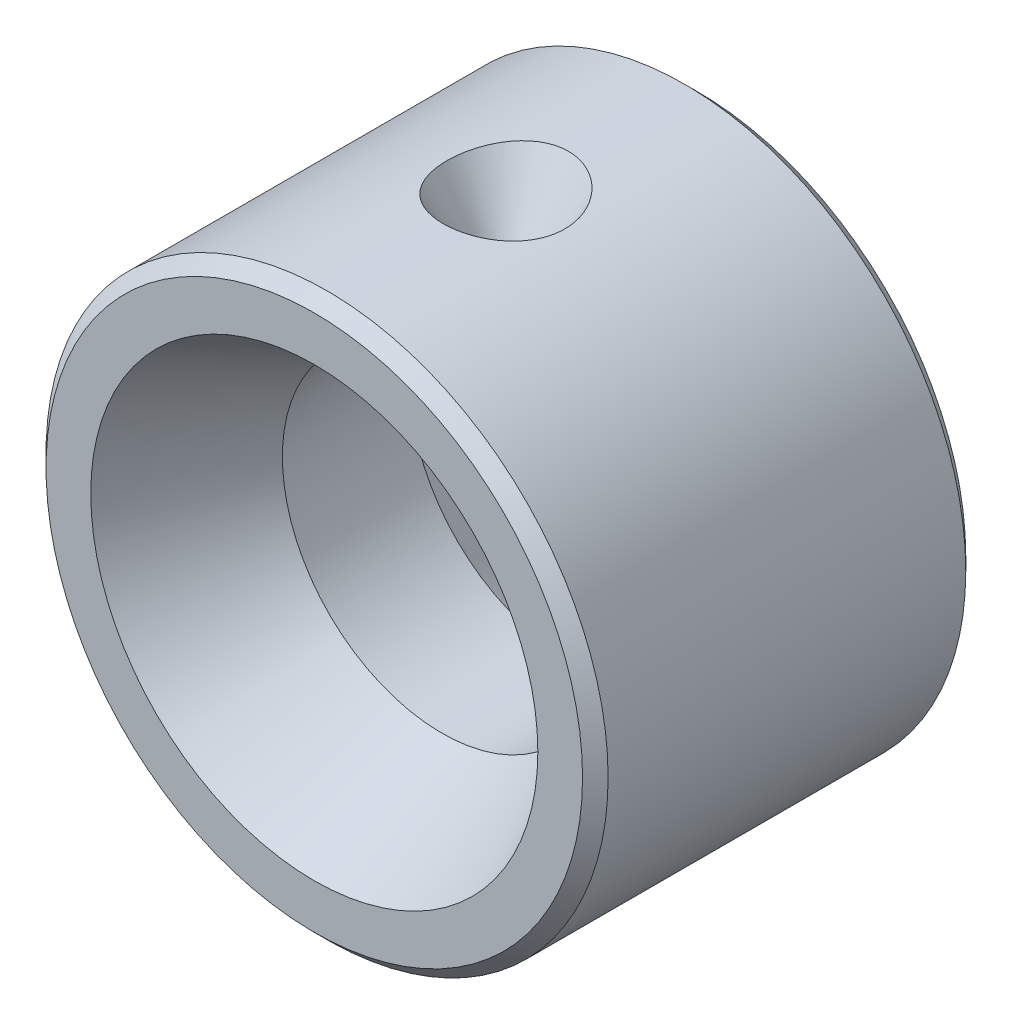
ISO-10303-21;
HEADER;
FILE_DESCRIPTION(('STEP AP214'),'2;1');
FILE_NAME('part.step','',(''),(''),'','','');
FILE_SCHEMA(('AUTOMOTIVE_DESIGN { 1 0 10303 214 1 1 1 1 }'));
ENDSEC;
DATA;
#1=APPLICATION_CONTEXT('core data for automotive mechanical design processes');
#2=APPLICATION_PROTOCOL_DEFINITION('international standard','automotive_design',2000,#1);
#3=PRODUCT_CONTEXT('',#1,'mechanical');
#4=PRODUCT('Part','Part','',(#3));
#5=PRODUCT_RELATED_PRODUCT_CATEGORY('part','',(#4));
#6=PRODUCT_DEFINITION_FORMATION('','',#4);
#7=PRODUCT_DEFINITION_CONTEXT('part definition',#1,'design');
#8=PRODUCT_DEFINITION('design','',#6,#7);
#9=PRODUCT_DEFINITION_SHAPE('','',#8);
#10=(LENGTH_UNIT() NAMED_UNIT(*) SI_UNIT(.MILLI.,.METRE.));
#11=(NAMED_UNIT(*) PLANE_ANGLE_UNIT() SI_UNIT($,.RADIAN.));
#12=(NAMED_UNIT(*) SI_UNIT($,.STERADIAN.) SOLID_ANGLE_UNIT());
#13=UNCERTAINTY_MEASURE_WITH_UNIT(LENGTH_MEASURE(1.E-05),#10,'distance_accuracy_value','');
#14=(GEOMETRIC_REPRESENTATION_CONTEXT(3) GLOBAL_UNCERTAINTY_ASSIGNED_CONTEXT((#13)) GLOBAL_UNIT_ASSIGNED_CONTEXT((#10,
#11,#12)) REPRESENTATION_CONTEXT('',''));
#15=CARTESIAN_POINT('',(0.,0.,0.));
#16=DIRECTION('',(0.,0.,1.));
#17=DIRECTION('',(1.,0.,0.));
#18=AXIS2_PLACEMENT_3D('',#15,#16,#17);
#19=CARTESIAN_POINT('',(0.,0.,15.));
#20=DIRECTION('',(0.,0.,-1.));
#21=DIRECTION('',(-1.,0.,0.));
#22=AXIS2_PLACEMENT_3D('',#19,#20,#21);
#23=CYLINDRICAL_SURFACE('',#22,22.);
#24=CARTESIAN_POINT('',(0.,0.,-14.));
#25=DIRECTION('',(0.,0.,1.));
#26=DIRECTION('',(1.,0.,0.));
#27=AXIS2_PLACEMENT_3D('',#24,#25,#26);
#28=CIRCLE('',#27,22.);
#29=CARTESIAN_POINT('',(22.,0.,-14.));
#30=VERTEX_POINT('',#29);
#31=EDGE_CURVE('E75',#30,#30,#28,.T.);
#32=ORIENTED_EDGE('',*,*,#31,.T.);
#33=EDGE_LOOP('',(#32));
#34=FACE_BOUND('',#33,.T.);
#35=CARTESIAN_POINT('',(0.,0.,14.));
#36=DIRECTION('',(0.,0.,1.));
#37=DIRECTION('',(1.,0.,0.));
#38=AXIS2_PLACEMENT_3D('',#35,#36,#37);
#39=CIRCLE('',#38,22.);
#40=CARTESIAN_POINT('',(22.,0.,14.));
#41=VERTEX_POINT('',#40);
#42=EDGE_CURVE('E71',#41,#41,#39,.F.);
#43=ORIENTED_EDGE('',*,*,#42,.T.);
#44=EDGE_LOOP('',(#43));
#45=FACE_BOUND('',#44,.T.);
#46=CARTESIAN_POINT('',(-3.99482145973664,-21.6342645813717,-2.46917415116023));
#47=CARTESIAN_POINT('',(-3.86755959370155,-21.6577634169543,-2.70086556031943));
#48=CARTESIAN_POINT('',(-3.72193169680851,-21.6835058371343,-2.92232084510366));
#49=CARTESIAN_POINT('',(-3.39673047581251,-21.7368194592095,-3.33869689986199));
#50=CARTESIAN_POINT('',(-3.21713833851181,-21.7643916691266,-3.5336028604263));
#51=CARTESIAN_POINT('',(-2.81987022044868,-21.8194881921199,-3.89806332118038));
#52=CARTESIAN_POINT('',(-2.60094855707441,-21.8469655468134,-4.06627512376035));
#53=CARTESIAN_POINT('',(-2.13608139818247,-21.8972974755466,-4.36090285168833));
#54=CARTESIAN_POINT('',(-1.89014578843575,-21.9201537320394,-4.48733399924678));
#55=CARTESIAN_POINT('',(-1.39433623794611,-21.9570889774808,-4.68651839375952));
#56=CARTESIAN_POINT('',(-1.14562859005345,-21.9716202529632,-4.76208781689322));
#57=CARTESIAN_POINT('',(-0.638465201664187,-21.9921945211101,-4.86810844120732));
#58=CARTESIAN_POINT('',(-0.380014065653917,-21.998241472839,-4.89858068657776));
#59=CARTESIAN_POINT('',(0.122438535735009,-22.0010072838138,-4.91257196544603));
#60=CARTESIAN_POINT('',(0.366364959656477,-21.9982700152922,-4.89882846689838));
#61=CARTESIAN_POINT('',(0.848275479673287,-21.9849614327014,-4.83092137968877));
#62=CARTESIAN_POINT('',(1.0862599815312,-21.9743906550885,-4.77676055889383));
#63=CARTESIAN_POINT('',(1.54770652218186,-21.9467002130645,-4.63086027435734));
#64=CARTESIAN_POINT('',(1.77127485592289,-21.9296370090131,-4.53944432005029));
#65=CARTESIAN_POINT('',(2.20064006603238,-21.8907223219123,-4.32238701081285));
#66=CARTESIAN_POINT('',(2.40643365143358,-21.8688699547948,-4.1967393357459));
#67=CARTESIAN_POINT('',(2.80511169684386,-21.8214022703149,-3.90850510848041));
#68=CARTESIAN_POINT('',(2.99691176941801,-21.7956571609989,-3.74444216382315));
#69=CARTESIAN_POINT('',(3.35220170266869,-21.7438508538335,-3.38814969341445));
#70=CARTESIAN_POINT('',(3.51568299826646,-21.7177895628955,-3.19591167839041));
#71=CARTESIAN_POINT('',(3.82108539408775,-21.6662159688897,-2.77490466411174));
#72=CARTESIAN_POINT('',(3.96086118423211,-21.6408543669693,-2.54455938090345));
#73=CARTESIAN_POINT('',(4.20196498972664,-21.5953372888723,-2.06408199843343));
#74=CARTESIAN_POINT('',(4.30328453761883,-21.5751829595666,-1.81394555610526));
#75=CARTESIAN_POINT('',(4.46903860338907,-21.5414770012287,-1.28907334950112));
#76=CARTESIAN_POINT('',(4.53165144941004,-21.5282553808837,-1.01373933450829));
#77=CARTESIAN_POINT('',(4.61138098144957,-21.5113189441883,-0.456274094251186));
#78=CARTESIAN_POINT('',(4.62849404944885,-21.5076048838542,-0.174142330248121));
#79=CARTESIAN_POINT('',(4.61676149353014,-21.5101269279164,0.392867963047969));
#80=CARTESIAN_POINT('',(4.58730557004597,-21.5164951651806,0.677733523777985));
#81=CARTESIAN_POINT('',(4.48195189544406,-21.5386853492594,1.23838481218089));
#82=CARTESIAN_POINT('',(4.40605092999234,-21.5545079503827,1.51416991002764));
#83=CARTESIAN_POINT('',(4.20951186744793,-21.5937489981628,2.04871447961326));
#84=CARTESIAN_POINT('',(4.08887957559934,-21.617166459107,2.307476155528));
#85=CARTESIAN_POINT('',(3.80551262636684,-21.6688425020407,2.8003545375352));
#86=CARTESIAN_POINT('',(3.64277707463098,-21.6971011868625,3.03447071996267));
#87=CARTESIAN_POINT('',(3.28173091602585,-21.7546099405697,3.46712969382574));
#88=CARTESIAN_POINT('',(3.08401469118702,-21.7838376756833,3.66617032201872));
#89=CARTESIAN_POINT('',(2.65609694133523,-21.8401364506344,4.02603073294612));
#90=CARTESIAN_POINT('',(2.4259059477169,-21.8672081852161,4.18686286128961));
#91=CARTESIAN_POINT('',(1.95184564821917,-21.914471234906,4.45665577087364));
#92=CARTESIAN_POINT('',(1.7092762238834,-21.9349434320783,4.56784706172383));
#93=CARTESIAN_POINT('',(1.20769032893539,-21.96826039591,4.74508692486018));
#94=CARTESIAN_POINT('',(0.948682668867584,-21.9811092109545,4.81115946021005));
#95=CARTESIAN_POINT('',(0.440717726328345,-21.9969521584714,4.89217750192815));
#96=CARTESIAN_POINT('',(0.192284900611781,-22.0005602754638,4.91031117124093));
#97=CARTESIAN_POINT('',(-0.303982266068755,-21.9992979483885,4.903925949218));
#98=CARTESIAN_POINT('',(-0.551816721839794,-21.994429286052,4.87941602112484));
#99=CARTESIAN_POINT('',(-1.03169643484996,-21.9770676154836,4.79028482263928));
#100=CARTESIAN_POINT('',(-1.26399315454051,-21.9648204851773,4.72695600193971));
#101=CARTESIAN_POINT('',(-1.71493996924531,-21.9342223001399,4.56381934070235));
#102=CARTESIAN_POINT('',(-1.93358862097743,-21.9158706011454,4.46400764972962));
#103=CARTESIAN_POINT('',(-2.35827972817011,-21.8743098971477,4.22794092998111));
#104=CARTESIAN_POINT('',(-2.56375661080294,-21.8509730683066,4.09069360419012));
#105=CARTESIAN_POINT('',(-2.95032191973516,-21.8021475304921,3.78566849223849));
#106=CARTESIAN_POINT('',(-3.13140348578363,-21.77665821948,3.61788214920238));
#107=CARTESIAN_POINT('',(-3.47653924983985,-21.7243213036815,3.24477900959074));
#108=CARTESIAN_POINT('',(-3.6387289657554,-21.6974927476406,3.03773449285334));
#109=CARTESIAN_POINT('',(-3.9283000799663,-21.6469425523198,2.60025508961185));
#110=CARTESIAN_POINT('',(-4.05567266920424,-21.623221700107,2.36981430382166));
#111=CARTESIAN_POINT('',(-4.27923944581652,-21.5801263856635,1.87819830285789));
#112=CARTESIAN_POINT('',(-4.37330844016181,-21.561066591933,1.61602686381199));
#113=CARTESIAN_POINT('',(-4.51797282432503,-21.5312194639465,1.07946461632016));
#114=CARTESIAN_POINT('',(-4.56855783467641,-21.5204341048335,0.805070906894245));
#115=CARTESIAN_POINT('',(-4.62581154676191,-21.5082025649201,0.245014021135881));
#116=CARTESIAN_POINT('',(-4.63142266665792,-21.5069813033438,-0.0407625369107706));
#117=CARTESIAN_POINT('',(-4.59579567087806,-21.5146230570222,-0.609143022779639));
#118=CARTESIAN_POINT('',(-4.55458155209958,-21.5234809069591,-0.891748500784607));
#119=CARTESIAN_POINT('',(-4.43791939419117,-21.5477986413272,-1.39579599066347));
#120=CARTESIAN_POINT('',(-4.36998185730309,-21.561780559552,-1.61908019337892));
#121=CARTESIAN_POINT('',(-4.20436456630107,-21.5946857394531,-2.05393643724407));
#122=CARTESIAN_POINT('',(-4.10668870261573,-21.6136083547313,-2.26551000612666));
#123=CARTESIAN_POINT('',(-3.99482145973664,-21.6342645813717,-2.46917415116023));
#124=B_SPLINE_CURVE_WITH_KNOTS('',3,(#46,#47,#48,#49,#50,#51,#52,#53,#54,#55,#56,#57,#58,#59,
#60,#61,#62,#63,#64,#65,#66,#67,#68,#69,#70,#71,#72,#73,#74,#75,#76,#77,#78,#79,#80,#81,#82,#83,
#84,#85,#86,#87,#88,#89,#90,#91,#92,#93,#94,#95,#96,#97,#98,#99,#100,#101,#102,#103,#104,#105,
#106,#107,#108,#109,#110,#111,#112,#113,#114,#115,#116,#117,#118,#119,#120,#121,#122,#123),
.UNSPECIFIED.,.T.,.F.,(4,2,2,2,2,2,2,2,2,2,2,2,2,2,2,2,2,2,2,2,2,2,2,2,2,2,2,2,2,2,2,2,2,2,2,2,
2,2,4),(0.,0.795398694150323,1.59123926643333,2.4192391730637,3.24693707579704,4.0238795363172,
4.80045932922442,5.52990642588355,6.25930357298664,6.98249747486786,7.70582498923479,
8.4636637178418,9.22173125780772,10.0300105554289,10.8384677203024,11.6825424630248,
12.5266843222806,13.3819809140047,14.237336705156,15.0925815268223,15.9478445169789,
16.7897694471749,17.631421970548,18.4300696072094,19.2282927427945,19.9719136515572,
20.715378277788,21.4353412727119,22.1553802751281,22.8967566107352,23.6383409968611,
24.427993599774,25.2178458076164,26.0515775491935,26.8855082442453,27.7389933093397,
28.5920411794642,29.2913134644189,29.9904943084252),.UNSPECIFIED.);
#125=CARTESIAN_POINT('',(-3.99482145973664,-21.6342645813717,-2.46917415116023));
#126=VERTEX_POINT('',#125);
#127=EDGE_CURVE('E69',#126,#126,#124,.T.);
#128=ORIENTED_EDGE('',*,*,#127,.F.);
#129=EDGE_LOOP('',(#128));
#130=FACE_BOUND('',#129,.T.);
#131=CARTESIAN_POINT('',(-3.99482145973664,21.6342645813717,-2.46917415116023));
#132=CARTESIAN_POINT('',(-4.12194993600798,21.6107922461442,-2.23770438988919));
#133=CARTESIAN_POINT('',(-4.23082681638628,21.5895442271892,-1.99587601768307));
#134=CARTESIAN_POINT('',(-4.40993288266609,21.5536739188678,-1.49770419039629));
#135=CARTESIAN_POINT('',(-4.48012968605505,21.5390571829377,-1.24134877082894));
#136=CARTESIAN_POINT('',(-4.58391181552291,21.5172219810257,-0.702405948216883));
#137=CARTESIAN_POINT('',(-4.6146127162798,21.5105884720979,-0.419233857443247));
#138=CARTESIAN_POINT('',(-4.62941387091818,21.5074074429535,0.148364574496331));
#139=CARTESIAN_POINT('',(-4.61351276727888,21.5108602165513,0.432790951958774));
#140=CARTESIAN_POINT('',(-4.53523283579244,21.527500042083,0.996704358341071));
#141=CARTESIAN_POINT('',(-4.47256551701758,21.5407475107182,1.27614965782397));
#142=CARTESIAN_POINT('',(-4.3018150973298,21.5754935697815,1.82029782683485));
#143=CARTESIAN_POINT('',(-4.19372866643684,21.5969927651891,2.08499961380503));
#144=CARTESIAN_POINT('',(-3.93498408817061,21.6456254446306,2.59099353969638));
#145=CARTESIAN_POINT('',(-3.78447714267211,21.6727388282231,2.83236480588868));
#146=CARTESIAN_POINT('',(-3.44405738442028,21.7294303413026,3.28526052984364));
#147=CARTESIAN_POINT('',(-3.25414710812958,21.7590083120665,3.49678690730325));
#148=CARTESIAN_POINT('',(-2.84501278339603,21.8162172704027,3.87747054732523));
#149=CARTESIAN_POINT('',(-2.62670982991757,21.8438791846457,4.04761065608843));
#150=CARTESIAN_POINT('',(-2.16270500836632,21.8946793846353,4.34611437556962));
#151=CARTESIAN_POINT('',(-1.91701583803252,21.9178197532281,4.47449723992517));
#152=CARTESIAN_POINT('',(-1.42157025383126,21.955339476316,4.67729509399482));
#153=CARTESIAN_POINT('',(-1.17302214757922,21.9701750523902,4.75457544398973));
#154=CARTESIAN_POINT('',(-0.66585247040732,21.9913824756,4.86398394899998));
#155=CARTESIAN_POINT('',(-0.407235511504586,21.9977581519006,4.89613253217863));
#156=CARTESIAN_POINT('',(0.0956702383355885,22.0011414827158,4.91325265628422));
#157=CARTESIAN_POINT('',(0.339865159721582,21.9986996287589,4.90099630024071));
#158=CARTESIAN_POINT('',(0.822553732770524,21.9859429447926,4.83595103647301));
#159=CARTESIAN_POINT('',(1.0610478344213,21.975628738309,4.78316533885358));
#160=CARTESIAN_POINT('',(1.52344132281724,21.9484013516125,4.63992787363928));
#161=CARTESIAN_POINT('',(1.74745932829758,21.9315528044313,4.54984445619438));
#162=CARTESIAN_POINT('',(2.17791750017378,21.8929998663339,4.33534589750124));
#163=CARTESIAN_POINT('',(2.38435445671928,21.8712945913162,4.21092450452511));
#164=CARTESIAN_POINT('',(2.78436854134902,21.8240643432798,3.92517398001018));
#165=CARTESIAN_POINT('',(2.97688642050967,21.7984078566529,3.76238595582302));
#166=CARTESIAN_POINT('',(3.33380027633372,21.7466863959658,3.40852389226028));
#167=CARTESIAN_POINT('',(3.49818776059316,21.7206213011324,3.21744134329203));
#168=CARTESIAN_POINT('',(3.80564905562748,21.668940527414,2.79866087804385));
#169=CARTESIAN_POINT('',(3.94658653809404,21.6434692764432,2.56937513640986));
#170=CARTESIAN_POINT('',(4.19018092242286,21.5976340321005,2.09082809963898));
#171=CARTESIAN_POINT('',(4.2928292831434,21.5772711785886,1.84156236261859));
#172=CARTESIAN_POINT('',(4.46149807552065,21.543046224194,1.3180954043664));
#173=CARTESIAN_POINT('',(4.5256781096693,21.5295150355998,1.04327773695296));
#174=CARTESIAN_POINT('',(4.60861813879136,21.5119142176079,0.48657504789064));
#175=CARTESIAN_POINT('',(4.62737445986265,21.5078453535308,0.204689456445865));
#176=CARTESIAN_POINT('',(4.61898869108523,21.5096483997231,-0.362227344284586));
#177=CARTESIAN_POINT('',(4.59121770397009,21.5156565191066,-0.647249078359554));
#178=CARTESIAN_POINT('',(4.48919854274462,21.5371719697939,-1.20850098205834));
#179=CARTESIAN_POINT('',(4.4149471608988,21.5526799567071,-1.48473054352826));
#180=CARTESIAN_POINT('',(4.2216215045106,21.5913773592854,-2.02048612530303));
#181=CARTESIAN_POINT('',(4.10254638608458,21.6145669195682,-2.28001183102146));
#182=CARTESIAN_POINT('',(3.82217561383337,21.6658995895539,-2.77468675631867));
#183=CARTESIAN_POINT('',(3.66087895377734,21.6940428173081,-3.00983539475262));
#184=CARTESIAN_POINT('',(3.30244481887516,21.7514648002818,-3.44490810478485));
#185=CARTESIAN_POINT('',(3.10588591652907,21.7807199628854,-3.64531086476659));
#186=CARTESIAN_POINT('',(2.68004981267872,21.8372000684637,-4.00810034624125));
#187=CARTESIAN_POINT('',(2.4507829341943,21.8644256478866,-4.17049901973101));
#188=CARTESIAN_POINT('',(1.97808634985246,21.9121122911473,-4.44360118581149));
#189=CARTESIAN_POINT('',(1.73595445187728,21.9328453046102,-4.55649913800791));
#190=CARTESIAN_POINT('',(1.23492133812163,21.9667435006806,-4.73718676849923));
#191=CARTESIAN_POINT('',(0.976029114709346,21.9799127046416,-4.8050004192122));
#192=CARTESIAN_POINT('',(0.468002506705438,21.996388750715,-4.88932975970088));
#193=CARTESIAN_POINT('',(0.21941574533956,22.0003097623911,-4.90904319935917));
#194=CARTESIAN_POINT('',(-0.277427442828713,21.9996519951808,-4.90571785630992));
#195=CARTESIAN_POINT('',(-0.525683934120797,21.9950752370593,-4.88268923764041));
#196=CARTESIAN_POINT('',(-1.00635717223013,21.9782451730953,-4.79636626958051));
#197=CARTESIAN_POINT('',(-1.23902641903142,21.9662478139014,-4.73441338917559));
#198=CARTESIAN_POINT('',(-1.69095422742761,21.9360894068092,-4.57390983565327));
#199=CARTESIAN_POINT('',(-1.91020979315438,21.9179269878689,-4.47535102131654));
#200=CARTESIAN_POINT('',(-2.33613370055255,21.8766914879675,-4.24177879160812));
#201=CARTESIAN_POINT('',(-2.54225567198068,21.8534917385694,-4.10579479496151));
#202=CARTESIAN_POINT('',(-2.93020120379456,21.8048661756267,-3.8032198013421));
#203=CARTESIAN_POINT('',(-3.11203187626336,21.7794410172688,-3.63663779702335));
#204=CARTESIAN_POINT('',(-3.41915872023852,21.7331362138049,-3.30841099183334));
#205=CARTESIAN_POINT('',(-3.54880431951058,21.7122235184522,-3.15080267149418));
#206=CARTESIAN_POINT('',(-3.78753673400074,21.6718530530873,-2.82058089070905));
#207=CARTESIAN_POINT('',(-3.89662394937381,21.6523952547608,-2.64796772241784));
#208=CARTESIAN_POINT('',(-3.99482145973664,21.6342645813717,-2.46917415116023));
#209=B_SPLINE_CURVE_WITH_KNOTS('',3,(#131,#132,#133,#134,#135,#136,#137,#138,#139,#140,#141,
#142,#143,#144,#145,#146,#147,#148,#149,#150,#151,#152,#153,#154,#155,#156,#157,#158,#159,#160,
#161,#162,#163,#164,#165,#166,#167,#168,#169,#170,#171,#172,#173,#174,#175,#176,#177,#178,#179,
#180,#181,#182,#183,#184,#185,#186,#187,#188,#189,#190,#191,#192,#193,#194,#195,#196,#197,#198,
#199,#200,#201,#202,#203,#204,#205,#206,#207,#208),.UNSPECIFIED.,.T.,.F.,(4,2,2,2,2,2,2,2,2,2,2,
2,2,2,2,2,2,2,2,2,2,2,2,2,2,2,2,2,2,2,2,2,2,2,2,2,2,2,4),(0.,0.794718222145065,1.59010076622602,
2.44077714071905,3.29147829574145,4.14747108163265,5.00352663705466,5.85656867544282,
6.70955581902147,7.5397026781259,8.36946622458392,9.14750375050117,9.92518899666171,
10.6551849637462,11.3851231178552,12.1080181794107,12.8310449414509,13.5880274619341,
14.3452381094407,15.1526629813004,15.960267857601,16.8039379065566,17.6476761898656,
18.5029113068902,19.3582054524698,20.2135157012323,21.0688463357477,21.9112488949864,
22.7533861679046,23.5530429758832,24.3522742461188,25.0967193934132,25.8409875347406,
26.5609153404555,27.2810033552566,28.021886945671,28.7625531402179,29.376427169963,
29.9902892498329),.UNSPECIFIED.);
#210=CARTESIAN_POINT('',(-3.99482145973664,21.6342645813717,-2.46917415116023));
#211=VERTEX_POINT('',#210);
#212=EDGE_CURVE('E45',#211,#211,#209,.T.);
#213=ORIENTED_EDGE('',*,*,#212,.F.);
#214=EDGE_LOOP('',(#213));
#215=FACE_BOUND('',#214,.T.);
#216=ADVANCED_FACE('F40',(#34,#45,#130,#215),#23,.T.);
#217=CARTESIAN_POINT('',(0.,0.,15.));
#218=DIRECTION('',(0.,0.,1.));
#219=DIRECTION('',(1.,0.,0.));
#220=AXIS2_PLACEMENT_3D('',#217,#218,#219);
#221=PLANE('',#220);
#222=CARTESIAN_POINT('',(0.,0.,15.));
#223=DIRECTION('',(0.,0.,1.));
#224=DIRECTION('',(1.,0.,0.));
#225=AXIS2_PLACEMENT_3D('',#222,#223,#224);
#226=CIRCLE('',#225,17.5);
#227=CARTESIAN_POINT('',(17.5,0.,15.));
#228=VERTEX_POINT('',#227);
#229=EDGE_CURVE('E128',#228,#228,#226,.F.);
#230=ORIENTED_EDGE('',*,*,#229,.T.);
#231=EDGE_LOOP('',(#230));
#232=FACE_BOUND('',#231,.T.);
#233=CARTESIAN_POINT('',(0.,0.,15.));
#234=DIRECTION('',(0.,0.,1.));
#235=DIRECTION('',(1.,0.,0.));
#236=AXIS2_PLACEMENT_3D('',#233,#234,#235);
#237=CIRCLE('',#236,21.);
#238=CARTESIAN_POINT('',(21.,0.,15.));
#239=VERTEX_POINT('',#238);
#240=EDGE_CURVE('E122',#239,#239,#237,.T.);
#241=ORIENTED_EDGE('',*,*,#240,.T.);
#242=EDGE_LOOP('',(#241));
#243=FACE_BOUND('',#242,.T.);
#244=ADVANCED_FACE('F95',(#232,#243),#221,.T.);
#245=CARTESIAN_POINT('',(0.,0.,-15.));
#246=DIRECTION('',(0.,0.,1.));
#247=DIRECTION('',(1.,0.,0.));
#248=AXIS2_PLACEMENT_3D('',#245,#246,#247);
#249=PLANE('',#248);
#250=CARTESIAN_POINT('',(0.,0.,-15.));
#251=DIRECTION('',(0.,0.,1.));
#252=DIRECTION('',(1.,0.,0.));
#253=AXIS2_PLACEMENT_3D('',#250,#251,#252);
#254=CIRCLE('',#253,17.5);
#255=CARTESIAN_POINT('',(17.5,0.,-15.));
#256=VERTEX_POINT('',#255);
#257=EDGE_CURVE('E55',#256,#256,#254,.T.);
#258=ORIENTED_EDGE('',*,*,#257,.T.);
#259=EDGE_LOOP('',(#258));
#260=FACE_BOUND('',#259,.T.);
#261=CARTESIAN_POINT('',(0.,0.,-15.));
#262=DIRECTION('',(0.,0.,1.));
#263=DIRECTION('',(1.,0.,0.));
#264=AXIS2_PLACEMENT_3D('',#261,#262,#263);
#265=CIRCLE('',#264,21.);
#266=CARTESIAN_POINT('',(21.,0.,-15.));
#267=VERTEX_POINT('',#266);
#268=EDGE_CURVE('E125',#267,#267,#265,.F.);
#269=ORIENTED_EDGE('',*,*,#268,.T.);
#270=EDGE_LOOP('',(#269));
#271=FACE_BOUND('',#270,.T.);
#272=ADVANCED_FACE('F93',(#260,#271),#249,.F.);
#273=CARTESIAN_POINT('',(0.,0.,15.));
#274=DIRECTION('',(0.,0.,-1.));
#275=DIRECTION('',(-1.,0.,0.));
#276=AXIS2_PLACEMENT_3D('',#273,#274,#275);
#277=CYLINDRICAL_SURFACE('',#276,12.5);
#278=CARTESIAN_POINT('',(0.,0.,-4.99999999999996));
#279=DIRECTION('',(0.,0.,1.));
#280=DIRECTION('',(1.,0.,0.));
#281=AXIS2_PLACEMENT_3D('',#278,#279,#280);
#282=CIRCLE('',#281,12.5);
#283=CARTESIAN_POINT('',(12.5,0.,-4.99999999999996));
#284=VERTEX_POINT('',#283);
#285=EDGE_CURVE('E11',#284,#284,#282,.F.);
#286=ORIENTED_EDGE('',*,*,#285,.T.);
#287=EDGE_LOOP('',(#286));
#288=FACE_BOUND('',#287,.T.);
#289=CARTESIAN_POINT('',(0.,0.,4.99999999999996));
#290=DIRECTION('',(0.,0.,1.));
#291=DIRECTION('',(1.,0.,0.));
#292=AXIS2_PLACEMENT_3D('',#289,#290,#291);
#293=CIRCLE('',#292,12.5);
#294=CARTESIAN_POINT('',(12.5,0.,4.99999999999996));
#295=VERTEX_POINT('',#294);
#296=EDGE_CURVE('E124',#295,#295,#293,.T.);
#297=ORIENTED_EDGE('',*,*,#296,.T.);
#298=EDGE_LOOP('',(#297));
#299=FACE_BOUND('',#298,.T.);
#300=ADVANCED_FACE('F89',(#288,#299),#277,.F.);
#301=CARTESIAN_POINT('',(0.,0.,-14.));
#302=DIRECTION('',(0.,0.,1.));
#303=DIRECTION('',(1.,0.,0.));
#304=AXIS2_PLACEMENT_3D('',#301,#302,#303);
#305=CONICAL_SURFACE('',#304,22.,0.785398163397452);
#306=ORIENTED_EDGE('',*,*,#268,.F.);
#307=EDGE_LOOP('',(#306));
#308=FACE_BOUND('',#307,.T.);
#309=ORIENTED_EDGE('',*,*,#31,.F.);
#310=EDGE_LOOP('',(#309));
#311=FACE_BOUND('',#310,.T.);
#312=ADVANCED_FACE('F92',(#308,#311),#305,.T.);
#313=CARTESIAN_POINT('',(0.,0.,15.));
#314=DIRECTION('',(0.,0.,-1.));
#315=DIRECTION('',(-1.,0.,0.));
#316=AXIS2_PLACEMENT_3D('',#313,#314,#315);
#317=CONICAL_SURFACE('',#316,21.,0.785398163397441);
#318=ORIENTED_EDGE('',*,*,#42,.F.);
#319=EDGE_LOOP('',(#318));
#320=FACE_BOUND('',#319,.T.);
#321=ORIENTED_EDGE('',*,*,#240,.F.);
#322=EDGE_LOOP('',(#321));
#323=FACE_BOUND('',#322,.T.);
#324=ADVANCED_FACE('F115',(#320,#323),#317,.T.);
#325=CARTESIAN_POINT('',(0.,0.,4.99999999999996));
#326=DIRECTION('',(0.,0.,1.));
#327=DIRECTION('',(1.,0.,0.));
#328=AXIS2_PLACEMENT_3D('',#325,#326,#327);
#329=CONICAL_SURFACE('',#328,12.5,0.463647609000804);
#330=ORIENTED_EDGE('',*,*,#229,.F.);
#331=EDGE_LOOP('',(#330));
#332=FACE_BOUND('',#331,.T.);
#333=ORIENTED_EDGE('',*,*,#296,.F.);
#334=EDGE_LOOP('',(#333));
#335=FACE_BOUND('',#334,.T.);
#336=ADVANCED_FACE('F118',(#332,#335),#329,.F.);
#337=CARTESIAN_POINT('',(0.,0.,-15.));
#338=DIRECTION('',(0.,0.,-1.));
#339=DIRECTION('',(-1.,0.,0.));
#340=AXIS2_PLACEMENT_3D('',#337,#338,#339);
#341=CONICAL_SURFACE('',#340,17.5,0.463647609000804);
#342=ORIENTED_EDGE('',*,*,#285,.F.);
#343=EDGE_LOOP('',(#342));
#344=FACE_BOUND('',#343,.T.);
#345=ORIENTED_EDGE('',*,*,#257,.F.);
#346=EDGE_LOOP('',(#345));
#347=FACE_BOUND('',#346,.T.);
#348=ADVANCED_FACE('F43',(#344,#347),#341,.F.);
#349=CARTESIAN_POINT('',(0.,-13.5,0.));
#350=DIRECTION('',(0.,-1.,0.));
#351=DIRECTION('',(0.,0.,-1.));
#352=AXIS2_PLACEMENT_3D('',#349,#350,#351);
#353=CONICAL_SURFACE('',#352,0.,0.523598775598293);
#354=CARTESIAN_POINT('',(0.,-13.5,0.));
#355=VERTEX_POINT('',#354);
#356=VERTEX_LOOP('',#355);
#357=FACE_BOUND('',#356,.T.);
#358=ORIENTED_EDGE('',*,*,#127,.T.);
#359=EDGE_LOOP('',(#358));
#360=FACE_BOUND('',#359,.T.);
#361=ADVANCED_FACE('F65',(#357,#360),#353,.F.);
#362=CARTESIAN_POINT('',(0.,13.5,0.));
#363=DIRECTION('',(0.,1.,0.));
#364=DIRECTION('',(0.,0.,-1.));
#365=AXIS2_PLACEMENT_3D('',#362,#363,#364);
#366=CONICAL_SURFACE('',#365,0.,0.523598775598293);
#367=CARTESIAN_POINT('',(0.,13.5,0.));
#368=VERTEX_POINT('',#367);
#369=VERTEX_LOOP('',#368);
#370=FACE_BOUND('',#369,.T.);
#371=ORIENTED_EDGE('',*,*,#212,.T.);
#372=EDGE_LOOP('',(#371));
#373=FACE_BOUND('',#372,.T.);
#374=ADVANCED_FACE('F62',(#370,#373),#366,.F.);
#375=CLOSED_SHELL('',(#216,#244,#272,#300,#312,#324,#336,#348,#361,#374));
#376=MANIFOLD_SOLID_BREP('B2',#375);
#377=ADVANCED_BREP_SHAPE_REPRESENTATION('',(#18,#376),#14);
#378=SHAPE_DEFINITION_REPRESENTATION(#9,#377);
ENDSEC;
END-ISO-10303-21;
